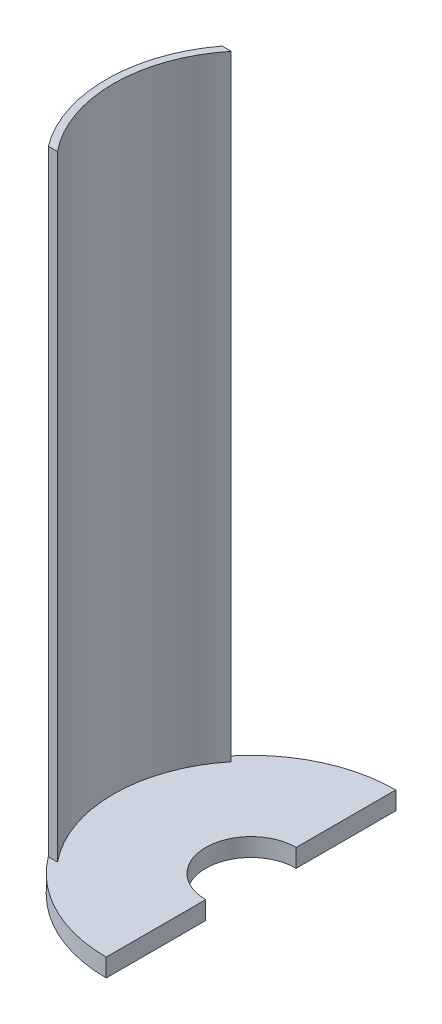
ISO-10303-21;
HEADER;
FILE_DESCRIPTION(('STEP AP214'),'2;1');
FILE_NAME('part.step','',(''),(''),'','','');
FILE_SCHEMA(('AUTOMOTIVE_DESIGN { 1 0 10303 214 1 1 1 1 }'));
ENDSEC;
DATA;
#1=APPLICATION_CONTEXT('core data for automotive mechanical design processes');
#2=APPLICATION_PROTOCOL_DEFINITION('international standard','automotive_design',2000,#1);
#3=PRODUCT_CONTEXT('',#1,'mechanical');
#4=PRODUCT('Part','Part','',(#3));
#5=PRODUCT_RELATED_PRODUCT_CATEGORY('part','',(#4));
#6=PRODUCT_DEFINITION_FORMATION('','',#4);
#7=PRODUCT_DEFINITION_CONTEXT('part definition',#1,'design');
#8=PRODUCT_DEFINITION('design','',#6,#7);
#9=PRODUCT_DEFINITION_SHAPE('','',#8);
#10=(LENGTH_UNIT() NAMED_UNIT(*) SI_UNIT(.MILLI.,.METRE.));
#11=(NAMED_UNIT(*) PLANE_ANGLE_UNIT() SI_UNIT($,.RADIAN.));
#12=(NAMED_UNIT(*) SI_UNIT($,.STERADIAN.) SOLID_ANGLE_UNIT());
#13=UNCERTAINTY_MEASURE_WITH_UNIT(LENGTH_MEASURE(1.E-05),#10,'distance_accuracy_value','');
#14=(GEOMETRIC_REPRESENTATION_CONTEXT(3) GLOBAL_UNCERTAINTY_ASSIGNED_CONTEXT((#13)) GLOBAL_UNIT_ASSIGNED_CONTEXT((#10,
#11,#12)) REPRESENTATION_CONTEXT('',''));
#15=CARTESIAN_POINT('',(0.,0.,0.));
#16=DIRECTION('',(0.,0.,1.));
#17=DIRECTION('',(1.,0.,0.));
#18=AXIS2_PLACEMENT_3D('',#15,#16,#17);
#19=CARTESIAN_POINT('',(0.,5.,0.));
#20=DIRECTION('',(0.,1.,0.));
#21=DIRECTION('',(0.,0.,1.));
#22=AXIS2_PLACEMENT_3D('',#19,#20,#21);
#23=PLANE('',#22);
#24=CARTESIAN_POINT('',(0.,5.,0.));
#25=DIRECTION('',(0.,1.,0.));
#26=DIRECTION('',(0.,0.,1.));
#27=AXIS2_PLACEMENT_3D('',#24,#25,#26);
#28=CIRCLE('',#27,38.);
#29=CARTESIAN_POINT('',(-29.4618397253125,5.,-24.));
#30=VERTEX_POINT('',#29);
#31=CARTESIAN_POINT('',(-29.4618397253125,5.,24.));
#32=VERTEX_POINT('',#31);
#33=EDGE_CURVE('E55',#30,#32,#28,.T.);
#34=ORIENTED_EDGE('',*,*,#33,.T.);
#35=DIRECTION('',(-1.,0.,0.));
#36=VECTOR('',#35,1.);
#37=CARTESIAN_POINT('',(0.,5.,24.));
#38=LINE('',#37,#36);
#39=CARTESIAN_POINT('',(-32.,5.,24.));
#40=VERTEX_POINT('',#39);
#41=EDGE_CURVE('E127',#32,#40,#38,.T.);
#42=ORIENTED_EDGE('',*,*,#41,.T.);
#43=CARTESIAN_POINT('',(0.,5.,0.));
#44=DIRECTION('',(0.,1.,0.));
#45=DIRECTION('',(0.,0.,1.));
#46=AXIS2_PLACEMENT_3D('',#43,#44,#45);
#47=CIRCLE('',#46,40.);
#48=CARTESIAN_POINT('',(0.,5.,40.));
#49=VERTEX_POINT('',#48);
#50=EDGE_CURVE('E157',#40,#49,#47,.T.);
#51=ORIENTED_EDGE('',*,*,#50,.T.);
#52=DIRECTION('',(0.,0.,-1.));
#53=VECTOR('',#52,1.);
#54=CARTESIAN_POINT('',(0.,5.,12.5));
#55=LINE('',#54,#53);
#56=CARTESIAN_POINT('',(0.,5.,12.5));
#57=VERTEX_POINT('',#56);
#58=EDGE_CURVE('E161',#49,#57,#55,.T.);
#59=ORIENTED_EDGE('',*,*,#58,.T.);
#60=CARTESIAN_POINT('',(0.,5.,0.));
#61=DIRECTION('',(0.,-1.,0.));
#62=DIRECTION('',(0.,0.,1.));
#63=AXIS2_PLACEMENT_3D('',#60,#61,#62);
#64=CIRCLE('',#63,12.5);
#65=CARTESIAN_POINT('',(0.,5.,-12.5));
#66=VERTEX_POINT('',#65);
#67=EDGE_CURVE('E149',#57,#66,#64,.T.);
#68=ORIENTED_EDGE('',*,*,#67,.T.);
#69=DIRECTION('',(0.,0.,-1.));
#70=VECTOR('',#69,1.);
#71=CARTESIAN_POINT('',(0.,5.,-40.));
#72=LINE('',#71,#70);
#73=CARTESIAN_POINT('',(0.,5.,-40.));
#74=VERTEX_POINT('',#73);
#75=EDGE_CURVE('E153',#66,#74,#72,.T.);
#76=ORIENTED_EDGE('',*,*,#75,.T.);
#77=CARTESIAN_POINT('',(-32.,5.,-24.));
#78=VERTEX_POINT('',#77);
#79=EDGE_CURVE('E158',#74,#78,#47,.T.);
#80=ORIENTED_EDGE('',*,*,#79,.T.);
#81=DIRECTION('',(-1.,0.,0.));
#82=VECTOR('',#81,1.);
#83=CARTESIAN_POINT('',(0.,5.,-24.));
#84=LINE('',#83,#82);
#85=EDGE_CURVE('E60',#30,#78,#84,.T.);
#86=ORIENTED_EDGE('',*,*,#85,.F.);
#87=EDGE_LOOP('',(#34,#42,#51,#59,#68,#76,#80,#86));
#88=FACE_BOUND('',#87,.T.);
#89=ADVANCED_FACE('F39',(#88),#23,.T.);
#90=CARTESIAN_POINT('',(0.,5.,0.));
#91=DIRECTION('',(0.,-1.,0.));
#92=DIRECTION('',(0.,0.,-1.));
#93=AXIS2_PLACEMENT_3D('',#90,#91,#92);
#94=CYLINDRICAL_SURFACE('',#93,12.5);
#95=CARTESIAN_POINT('',(0.,0.,0.));
#96=DIRECTION('',(0.,-1.,0.));
#97=DIRECTION('',(0.,0.,1.));
#98=AXIS2_PLACEMENT_3D('',#95,#96,#97);
#99=CIRCLE('',#98,12.5);
#100=CARTESIAN_POINT('',(0.,0.,12.5));
#101=VERTEX_POINT('',#100);
#102=CARTESIAN_POINT('',(0.,0.,-12.5));
#103=VERTEX_POINT('',#102);
#104=EDGE_CURVE('E111',#101,#103,#99,.T.);
#105=ORIENTED_EDGE('',*,*,#104,.T.);
#106=DIRECTION('',(0.,-1.,0.));
#107=VECTOR('',#106,1.);
#108=CARTESIAN_POINT('',(0.,5.,-12.5));
#109=LINE('',#108,#107);
#110=EDGE_CURVE('E11',#66,#103,#109,.T.);
#111=ORIENTED_EDGE('',*,*,#110,.F.);
#112=ORIENTED_EDGE('',*,*,#67,.F.);
#113=DIRECTION('',(0.,-1.,0.));
#114=VECTOR('',#113,1.);
#115=CARTESIAN_POINT('',(0.,5.,12.5));
#116=LINE('',#115,#114);
#117=EDGE_CURVE('E164',#57,#101,#116,.T.);
#118=ORIENTED_EDGE('',*,*,#117,.T.);
#119=EDGE_LOOP('',(#105,#111,#112,#118));
#120=FACE_BOUND('',#119,.T.);
#121=ADVANCED_FACE('F41',(#120),#94,.F.);
#122=CARTESIAN_POINT('',(0.,5.,-40.));
#123=DIRECTION('',(-1.,0.,0.));
#124=DIRECTION('',(0.,0.,1.));
#125=AXIS2_PLACEMENT_3D('',#122,#123,#124);
#126=PLANE('',#125);
#127=DIRECTION('',(0.,0.,-1.));
#128=VECTOR('',#127,1.);
#129=CARTESIAN_POINT('',(0.,0.,-40.));
#130=LINE('',#129,#128);
#131=CARTESIAN_POINT('',(0.,0.,-40.));
#132=VERTEX_POINT('',#131);
#133=EDGE_CURVE('E168',#103,#132,#130,.T.);
#134=ORIENTED_EDGE('',*,*,#133,.T.);
#135=DIRECTION('',(0.,-1.,0.));
#136=VECTOR('',#135,1.);
#137=CARTESIAN_POINT('',(0.,5.,-40.));
#138=LINE('',#137,#136);
#139=EDGE_CURVE('E48',#74,#132,#138,.T.);
#140=ORIENTED_EDGE('',*,*,#139,.F.);
#141=ORIENTED_EDGE('',*,*,#75,.F.);
#142=ORIENTED_EDGE('',*,*,#110,.T.);
#143=EDGE_LOOP('',(#134,#140,#141,#142));
#144=FACE_BOUND('',#143,.T.);
#145=ADVANCED_FACE('F223',(#144),#126,.F.);
#146=CARTESIAN_POINT('',(0.,5.,0.));
#147=DIRECTION('',(0.,-1.,0.));
#148=DIRECTION('',(0.,0.,-1.));
#149=AXIS2_PLACEMENT_3D('',#146,#147,#148);
#150=CYLINDRICAL_SURFACE('',#149,40.);
#151=CARTESIAN_POINT('',(0.,0.,0.));
#152=DIRECTION('',(0.,1.,0.));
#153=DIRECTION('',(0.,0.,1.));
#154=AXIS2_PLACEMENT_3D('',#151,#152,#153);
#155=CIRCLE('',#154,40.);
#156=CARTESIAN_POINT('',(0.,0.,40.));
#157=VERTEX_POINT('',#156);
#158=EDGE_CURVE('E171',#132,#157,#155,.T.);
#159=ORIENTED_EDGE('',*,*,#158,.T.);
#160=DIRECTION('',(0.,-1.,0.));
#161=VECTOR('',#160,1.);
#162=CARTESIAN_POINT('',(0.,5.,40.));
#163=LINE('',#162,#161);
#164=EDGE_CURVE('E179',#49,#157,#163,.T.);
#165=ORIENTED_EDGE('',*,*,#164,.F.);
#166=ORIENTED_EDGE('',*,*,#50,.F.);
#167=DIRECTION('',(0.,-1.,0.));
#168=VECTOR('',#167,1.);
#169=CARTESIAN_POINT('',(-32.,175.,24.));
#170=LINE('',#169,#168);
#171=CARTESIAN_POINT('',(-32.,175.,24.));
#172=VERTEX_POINT('',#171);
#173=EDGE_CURVE('E143',#172,#40,#170,.T.);
#174=ORIENTED_EDGE('',*,*,#173,.F.);
#175=CARTESIAN_POINT('',(0.,175.,0.));
#176=DIRECTION('',(0.,1.,0.));
#177=DIRECTION('',(0.,0.,1.));
#178=AXIS2_PLACEMENT_3D('',#175,#176,#177);
#179=CIRCLE('',#178,40.);
#180=CARTESIAN_POINT('',(-32.,175.,-24.));
#181=VERTEX_POINT('',#180);
#182=EDGE_CURVE('E121',#181,#172,#179,.T.);
#183=ORIENTED_EDGE('',*,*,#182,.F.);
#184=DIRECTION('',(0.,-1.,0.));
#185=VECTOR('',#184,1.);
#186=CARTESIAN_POINT('',(-32.,175.,-24.));
#187=LINE('',#186,#185);
#188=EDGE_CURVE('E112',#181,#78,#187,.T.);
#189=ORIENTED_EDGE('',*,*,#188,.T.);
#190=ORIENTED_EDGE('',*,*,#79,.F.);
#191=ORIENTED_EDGE('',*,*,#139,.T.);
#192=EDGE_LOOP('',(#159,#165,#166,#174,#183,#189,#190,#191));
#193=FACE_BOUND('',#192,.T.);
#194=ADVANCED_FACE('F188',(#193),#150,.T.);
#195=CARTESIAN_POINT('',(0.,5.,12.5));
#196=DIRECTION('',(-1.,0.,0.));
#197=DIRECTION('',(0.,0.,1.));
#198=AXIS2_PLACEMENT_3D('',#195,#196,#197);
#199=PLANE('',#198);
#200=DIRECTION('',(0.,0.,-1.));
#201=VECTOR('',#200,1.);
#202=CARTESIAN_POINT('',(0.,0.,12.5));
#203=LINE('',#202,#201);
#204=EDGE_CURVE('E154',#157,#101,#203,.T.);
#205=ORIENTED_EDGE('',*,*,#204,.T.);
#206=ORIENTED_EDGE('',*,*,#117,.F.);
#207=ORIENTED_EDGE('',*,*,#58,.F.);
#208=ORIENTED_EDGE('',*,*,#164,.T.);
#209=EDGE_LOOP('',(#205,#206,#207,#208));
#210=FACE_BOUND('',#209,.T.);
#211=ADVANCED_FACE('F197',(#210),#199,.F.);
#212=CARTESIAN_POINT('',(0.,0.,0.));
#213=DIRECTION('',(0.,1.,0.));
#214=DIRECTION('',(0.,0.,1.));
#215=AXIS2_PLACEMENT_3D('',#212,#213,#214);
#216=PLANE('',#215);
#217=ORIENTED_EDGE('',*,*,#104,.F.);
#218=ORIENTED_EDGE('',*,*,#204,.F.);
#219=ORIENTED_EDGE('',*,*,#158,.F.);
#220=ORIENTED_EDGE('',*,*,#133,.F.);
#221=EDGE_LOOP('',(#217,#218,#219,#220));
#222=FACE_BOUND('',#221,.T.);
#223=ADVANCED_FACE('F194',(#222),#216,.F.);
#224=CARTESIAN_POINT('',(0.,175.,0.));
#225=DIRECTION('',(0.,-1.,0.));
#226=DIRECTION('',(0.,0.,-1.));
#227=AXIS2_PLACEMENT_3D('',#224,#225,#226);
#228=CYLINDRICAL_SURFACE('',#227,38.);
#229=ORIENTED_EDGE('',*,*,#33,.F.);
#230=DIRECTION('',(0.,-1.,0.));
#231=VECTOR('',#230,1.);
#232=CARTESIAN_POINT('',(-29.4618397253125,175.,-24.));
#233=LINE('',#232,#231);
#234=CARTESIAN_POINT('',(-29.4618397253125,175.,-24.));
#235=VERTEX_POINT('',#234);
#236=EDGE_CURVE('E103',#235,#30,#233,.T.);
#237=ORIENTED_EDGE('',*,*,#236,.F.);
#238=CARTESIAN_POINT('',(0.,175.,0.));
#239=DIRECTION('',(0.,1.,0.));
#240=DIRECTION('',(0.,0.,1.));
#241=AXIS2_PLACEMENT_3D('',#238,#239,#240);
#242=CIRCLE('',#241,38.);
#243=CARTESIAN_POINT('',(-29.4618397253125,175.,24.));
#244=VERTEX_POINT('',#243);
#245=EDGE_CURVE('E107',#235,#244,#242,.T.);
#246=ORIENTED_EDGE('',*,*,#245,.T.);
#247=DIRECTION('',(0.,-1.,0.));
#248=VECTOR('',#247,1.);
#249=CARTESIAN_POINT('',(-29.4618397253125,175.,24.));
#250=LINE('',#249,#248);
#251=EDGE_CURVE('E136',#244,#32,#250,.T.);
#252=ORIENTED_EDGE('',*,*,#251,.T.);
#253=EDGE_LOOP('',(#229,#237,#246,#252));
#254=FACE_BOUND('',#253,.T.);
#255=ADVANCED_FACE('F105',(#254),#228,.F.);
#256=CARTESIAN_POINT('',(0.,175.,-24.));
#257=DIRECTION('',(0.,0.,1.));
#258=DIRECTION('',(1.,0.,0.));
#259=AXIS2_PLACEMENT_3D('',#256,#257,#258);
#260=PLANE('',#259);
#261=ORIENTED_EDGE('',*,*,#85,.T.);
#262=ORIENTED_EDGE('',*,*,#188,.F.);
#263=DIRECTION('',(-1.,0.,0.));
#264=VECTOR('',#263,1.);
#265=CARTESIAN_POINT('',(0.,175.,-24.));
#266=LINE('',#265,#264);
#267=EDGE_CURVE('E115',#235,#181,#266,.T.);
#268=ORIENTED_EDGE('',*,*,#267,.F.);
#269=ORIENTED_EDGE('',*,*,#236,.T.);
#270=EDGE_LOOP('',(#261,#262,#268,#269));
#271=FACE_BOUND('',#270,.T.);
#272=ADVANCED_FACE('F116',(#271),#260,.F.);
#273=CARTESIAN_POINT('',(0.,175.,24.));
#274=DIRECTION('',(0.,0.,1.));
#275=DIRECTION('',(1.,0.,0.));
#276=AXIS2_PLACEMENT_3D('',#273,#274,#275);
#277=PLANE('',#276);
#278=ORIENTED_EDGE('',*,*,#41,.F.);
#279=ORIENTED_EDGE('',*,*,#251,.F.);
#280=DIRECTION('',(-1.,0.,0.));
#281=VECTOR('',#280,1.);
#282=CARTESIAN_POINT('',(0.,175.,24.));
#283=LINE('',#282,#281);
#284=EDGE_CURVE('E125',#244,#172,#283,.T.);
#285=ORIENTED_EDGE('',*,*,#284,.T.);
#286=ORIENTED_EDGE('',*,*,#173,.T.);
#287=EDGE_LOOP('',(#278,#279,#285,#286));
#288=FACE_BOUND('',#287,.T.);
#289=ADVANCED_FACE('F207',(#288),#277,.T.);
#290=CARTESIAN_POINT('',(0.,175.,0.));
#291=DIRECTION('',(0.,1.,0.));
#292=DIRECTION('',(0.,0.,1.));
#293=AXIS2_PLACEMENT_3D('',#290,#291,#292);
#294=PLANE('',#293);
#295=ORIENTED_EDGE('',*,*,#245,.F.);
#296=ORIENTED_EDGE('',*,*,#267,.T.);
#297=ORIENTED_EDGE('',*,*,#182,.T.);
#298=ORIENTED_EDGE('',*,*,#284,.F.);
#299=EDGE_LOOP('',(#295,#296,#297,#298));
#300=FACE_BOUND('',#299,.T.);
#301=ADVANCED_FACE('F123',(#300),#294,.T.);
#302=CLOSED_SHELL('',(#89,#121,#145,#194,#211,#223,#255,#272,#289,#301));
#303=MANIFOLD_SOLID_BREP('B2',#302);
#304=ADVANCED_BREP_SHAPE_REPRESENTATION('',(#18,#303),#14);
#305=SHAPE_DEFINITION_REPRESENTATION(#9,#304);
ENDSEC;
END-ISO-10303-21;
